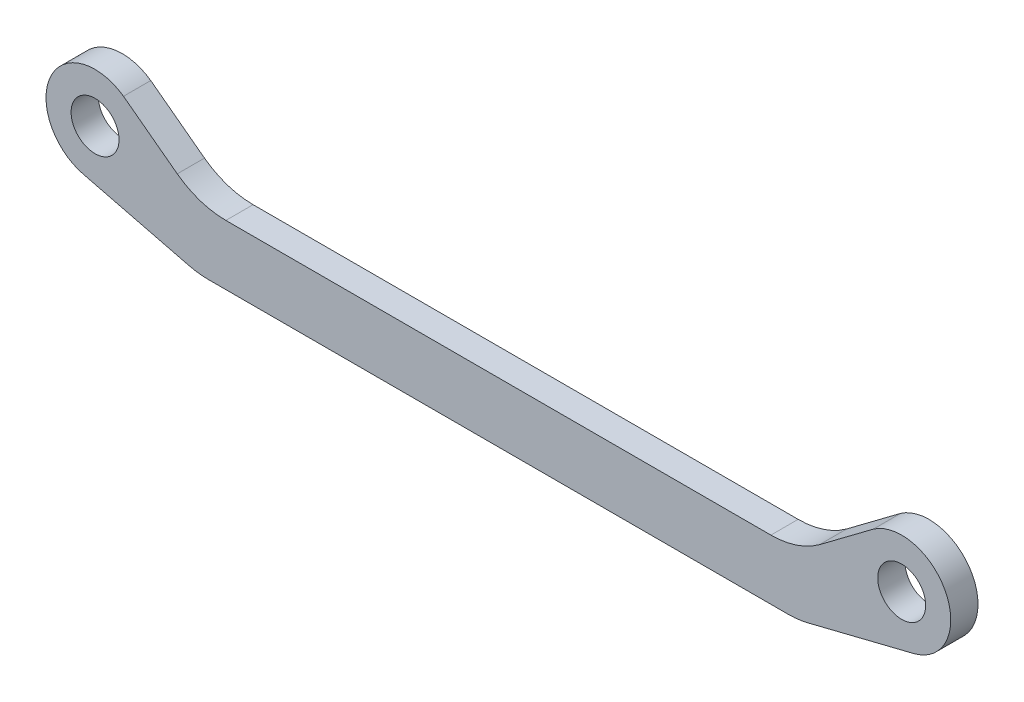
ISO-10303-21;
HEADER;
FILE_DESCRIPTION(('STEP AP214'),'2;1');
FILE_NAME('part.step','',(''),(''),'','','');
FILE_SCHEMA(('AUTOMOTIVE_DESIGN { 1 0 10303 214 1 1 1 1 }'));
ENDSEC;
DATA;
#1=APPLICATION_CONTEXT('core data for automotive mechanical design processes');
#2=APPLICATION_PROTOCOL_DEFINITION('international standard','automotive_design',2000,#1);
#3=PRODUCT_CONTEXT('',#1,'mechanical');
#4=PRODUCT('Part','Part','',(#3));
#5=PRODUCT_RELATED_PRODUCT_CATEGORY('part','',(#4));
#6=PRODUCT_DEFINITION_FORMATION('','',#4);
#7=PRODUCT_DEFINITION_CONTEXT('part definition',#1,'design');
#8=PRODUCT_DEFINITION('design','',#6,#7);
#9=PRODUCT_DEFINITION_SHAPE('','',#8);
#10=(LENGTH_UNIT() NAMED_UNIT(*) SI_UNIT(.MILLI.,.METRE.));
#11=(NAMED_UNIT(*) PLANE_ANGLE_UNIT() SI_UNIT($,.RADIAN.));
#12=(NAMED_UNIT(*) SI_UNIT($,.STERADIAN.) SOLID_ANGLE_UNIT());
#13=UNCERTAINTY_MEASURE_WITH_UNIT(LENGTH_MEASURE(1.E-05),#10,'distance_accuracy_value','');
#14=(GEOMETRIC_REPRESENTATION_CONTEXT(3) GLOBAL_UNCERTAINTY_ASSIGNED_CONTEXT((#13)) GLOBAL_UNIT_ASSIGNED_CONTEXT((#10,
#11,#12)) REPRESENTATION_CONTEXT('',''));
#15=CARTESIAN_POINT('',(0.,0.,0.));
#16=DIRECTION('',(0.,0.,1.));
#17=DIRECTION('',(1.,0.,0.));
#18=AXIS2_PLACEMENT_3D('',#15,#16,#17);
#19=CARTESIAN_POINT('',(-73.6141700346524,2.68327677533398,5.));
#20=DIRECTION('',(0.,0.,1.));
#21=DIRECTION('',(1.,0.,0.));
#22=AXIS2_PLACEMENT_3D('',#19,#20,#21);
#23=PLANE('',#22);
#24=CARTESIAN_POINT('',(-73.6141700346524,2.68327677533398,5.));
#25=DIRECTION('',(0.,0.,1.));
#26=DIRECTION('',(1.,0.,0.));
#27=AXIS2_PLACEMENT_3D('',#24,#25,#26);
#28=CIRCLE('',#27,4.40000000666373);
#29=CARTESIAN_POINT('',(-69.2141700279886,2.68327677533398,5.));
#30=VERTEX_POINT('',#29);
#31=EDGE_CURVE('E157',#30,#30,#28,.T.);
#32=ORIENTED_EDGE('',*,*,#31,.F.);
#33=EDGE_LOOP('',(#32));
#34=FACE_BOUND('',#33,.T.);
#35=CARTESIAN_POINT('',(-73.6141700346524,2.68327677533398,5.));
#36=DIRECTION('',(0.,0.,1.));
#37=DIRECTION('',(1.,0.,0.));
#38=AXIS2_PLACEMENT_3D('',#35,#36,#37);
#39=CIRCLE('',#38,9.);
#40=CARTESIAN_POINT('',(-68.395303593137,10.0156319948814,5.));
#41=VERTEX_POINT('',#40);
#42=CARTESIAN_POINT('',(-75.5919336060408,-6.09672614355442,5.));
#43=VERTEX_POINT('',#42);
#44=EDGE_CURVE('E176',#41,#43,#39,.T.);
#45=ORIENTED_EDGE('',*,*,#44,.T.);
#46=DIRECTION('',(0.970405668227117,-0.241480514892367,0.));
#47=VECTOR('',#46,1.);
#48=CARTESIAN_POINT('',(-75.5919336060408,-6.09672614355442,5.));
#49=LINE('',#48,#47);
#50=CARTESIAN_POINT('',(-56.3989244363623,-10.8728088565657,5.));
#51=VERTEX_POINT('',#50);
#52=EDGE_CURVE('E104',#43,#51,#49,.T.);
#53=ORIENTED_EDGE('',*,*,#52,.T.);
#54=CARTESIAN_POINT('',(-52.7767167129768,3.68327616684083,5.));
#55=DIRECTION('',(0.,0.,1.));
#56=DIRECTION('',(1.,0.,0.));
#57=AXIS2_PLACEMENT_3D('',#54,#55,#56);
#58=CIRCLE('',#57,14.9999999999997);
#59=CARTESIAN_POINT('',(-52.7767167129768,-11.3167238331587,5.));
#60=VERTEX_POINT('',#59);
#61=EDGE_CURVE('E203',#51,#60,#58,.T.);
#62=ORIENTED_EDGE('',*,*,#61,.T.);
#63=DIRECTION('',(1.,0.,0.));
#64=VECTOR('',#63,1.);
#65=CARTESIAN_POINT('',(-52.7767167129768,-11.3167238331587,5.));
#66=LINE('',#65,#64);
#67=CARTESIAN_POINT('',(53.5483758441745,-11.3167238331588,5.));
#68=VERTEX_POINT('',#67);
#69=EDGE_CURVE('E222',#60,#68,#66,.T.);
#70=ORIENTED_EDGE('',*,*,#69,.T.);
#71=CARTESIAN_POINT('',(53.5483758441745,3.68327616684128,5.));
#72=DIRECTION('',(0.,0.,1.));
#73=DIRECTION('',(1.,0.,0.));
#74=AXIS2_PLACEMENT_3D('',#71,#72,#73);
#75=CIRCLE('',#74,15.);
#76=CARTESIAN_POINT('',(57.1705835675583,-10.8728088565659,5.));
#77=VERTEX_POINT('',#76);
#78=EDGE_CURVE('E219',#68,#77,#75,.T.);
#79=ORIENTED_EDGE('',*,*,#78,.T.);
#80=DIRECTION('',(0.970405649115692,0.2414805916929,0.));
#81=VECTOR('',#80,1.);
#82=CARTESIAN_POINT('',(57.1705835675583,-10.8728088565659,5.));
#83=LINE('',#82,#81);
#84=CARTESIAN_POINT('',(76.3635862550964,-6.09672614355442,5.));
#85=VERTEX_POINT('',#84);
#86=EDGE_CURVE('E221',#77,#85,#83,.T.);
#87=ORIENTED_EDGE('',*,*,#86,.T.);
#88=CARTESIAN_POINT('',(74.3858291688885,2.68327823616854,5.));
#89=DIRECTION('',(0.,0.,1.));
#90=DIRECTION('',(1.,0.,0.));
#91=AXIS2_PLACEMENT_3D('',#88,#89,#90);
#92=CIRCLE('',#91,9.);
#93=CARTESIAN_POINT('',(69.1669606749438,10.0156319948814,5.));
#94=VERTEX_POINT('',#93);
#95=EDGE_CURVE('E224',#85,#94,#92,.T.);
#96=ORIENTED_EDGE('',*,*,#95,.T.);
#97=DIRECTION('',(-0.800152231556398,-0.599796970928761,0.));
#98=VECTOR('',#97,1.);
#99=CARTESIAN_POINT('',(69.1669606749438,10.0156319948814,5.));
#100=LINE('',#99,#98);
#101=CARTESIAN_POINT('',(59.3056303691909,2.62354357289025,5.));
#102=VERTEX_POINT('',#101);
#103=EDGE_CURVE('E230',#94,#102,#100,.T.);
#104=ORIENTED_EDGE('',*,*,#103,.T.);
#105=CARTESIAN_POINT('',(50.3858299247565,14.6832765728977,5.));
#106=DIRECTION('',(0.,0.,-1.));
#107=DIRECTION('',(1.,0.,0.));
#108=AXIS2_PLACEMENT_3D('',#105,#106,#107);
#109=CIRCLE('',#108,15.);
#110=CARTESIAN_POINT('',(50.3858299247565,-0.316723427102195,5.));
#111=VERTEX_POINT('',#110);
#112=EDGE_CURVE('E135',#102,#111,#109,.T.);
#113=ORIENTED_EDGE('',*,*,#112,.T.);
#114=DIRECTION('',(-1.,0.,0.));
#115=VECTOR('',#114,1.);
#116=CARTESIAN_POINT('',(50.3858299247565,-0.316723427102195,5.));
#117=LINE('',#116,#115);
#118=CARTESIAN_POINT('',(-49.614170039987,-0.316723427102324,5.));
#119=VERTEX_POINT('',#118);
#120=EDGE_CURVE('E129',#111,#119,#117,.T.);
#121=ORIENTED_EDGE('',*,*,#120,.T.);
#122=CARTESIAN_POINT('',(-49.614170039987,14.6832765728979,5.));
#123=DIRECTION('',(0.,0.,-1.));
#124=DIRECTION('',(1.,0.,0.));
#125=AXIS2_PLACEMENT_3D('',#122,#123,#124);
#126=CIRCLE('',#125,15.0000000000002);
#127=CARTESIAN_POINT('',(-58.5339704844212,2.62354357289016,5.));
#128=VERTEX_POINT('',#127);
#129=EDGE_CURVE('E133',#119,#128,#126,.T.);
#130=ORIENTED_EDGE('',*,*,#129,.T.);
#131=DIRECTION('',(-0.800152313377043,0.599796861776857,0.));
#132=VECTOR('',#131,1.);
#133=CARTESIAN_POINT('',(-58.5339704844212,2.62354357289016,5.));
#134=LINE('',#133,#132);
#135=EDGE_CURVE('E49',#128,#41,#134,.T.);
#136=ORIENTED_EDGE('',*,*,#135,.T.);
#137=EDGE_LOOP('',(#45,#53,#62,#70,#79,#87,#96,#104,#113,#121,#130,#136));
#138=FACE_BOUND('',#137,.T.);
#139=CARTESIAN_POINT('',(74.3858291688885,2.68327823616854,5.));
#140=DIRECTION('',(0.,0.,1.));
#141=DIRECTION('',(1.,0.,0.));
#142=AXIS2_PLACEMENT_3D('',#139,#140,#141);
#143=CIRCLE('',#142,4.4);
#144=CARTESIAN_POINT('',(78.7858291688885,2.68327823616854,5.));
#145=VERTEX_POINT('',#144);
#146=EDGE_CURVE('E272',#145,#145,#143,.T.);
#147=ORIENTED_EDGE('',*,*,#146,.F.);
#148=EDGE_LOOP('',(#147));
#149=FACE_BOUND('',#148,.T.);
#150=ADVANCED_FACE('F32',(#34,#138,#149),#23,.T.);
#151=CARTESIAN_POINT('',(-73.6141700346524,2.68327677533398,0.));
#152=DIRECTION('',(0.,0.,1.));
#153=DIRECTION('',(1.,0.,0.));
#154=AXIS2_PLACEMENT_3D('',#151,#152,#153);
#155=PLANE('',#154);
#156=CARTESIAN_POINT('',(-73.6141700346524,2.68327677533398,0.));
#157=DIRECTION('',(0.,0.,1.));
#158=DIRECTION('',(1.,0.,0.));
#159=AXIS2_PLACEMENT_3D('',#156,#157,#158);
#160=CIRCLE('',#159,9.);
#161=CARTESIAN_POINT('',(-68.395303593137,10.0156319948814,0.));
#162=VERTEX_POINT('',#161);
#163=CARTESIAN_POINT('',(-75.5919336060408,-6.09672614355442,0.));
#164=VERTEX_POINT('',#163);
#165=EDGE_CURVE('E153',#162,#164,#160,.T.);
#166=ORIENTED_EDGE('',*,*,#165,.F.);
#167=DIRECTION('',(-0.800152313377043,0.599796861776857,0.));
#168=VECTOR('',#167,1.);
#169=CARTESIAN_POINT('',(-58.5339704844212,2.62354357289016,0.));
#170=LINE('',#169,#168);
#171=CARTESIAN_POINT('',(-58.5339704844212,2.62354357289016,0.));
#172=VERTEX_POINT('',#171);
#173=EDGE_CURVE('E96',#172,#162,#170,.T.);
#174=ORIENTED_EDGE('',*,*,#173,.F.);
#175=CARTESIAN_POINT('',(-49.614170039987,14.6832765728979,0.));
#176=DIRECTION('',(0.,0.,-1.));
#177=DIRECTION('',(1.,0.,0.));
#178=AXIS2_PLACEMENT_3D('',#175,#176,#177);
#179=CIRCLE('',#178,15.0000000000002);
#180=CARTESIAN_POINT('',(-49.614170039987,-0.316723427102324,0.));
#181=VERTEX_POINT('',#180);
#182=EDGE_CURVE('E90',#181,#172,#179,.T.);
#183=ORIENTED_EDGE('',*,*,#182,.F.);
#184=DIRECTION('',(-1.,0.,0.));
#185=VECTOR('',#184,1.);
#186=CARTESIAN_POINT('',(50.3858299247565,-0.316723427102195,0.));
#187=LINE('',#186,#185);
#188=CARTESIAN_POINT('',(50.3858299247565,-0.316723427102195,0.));
#189=VERTEX_POINT('',#188);
#190=EDGE_CURVE('E143',#189,#181,#187,.T.);
#191=ORIENTED_EDGE('',*,*,#190,.F.);
#192=CARTESIAN_POINT('',(50.3858299247565,14.6832765728977,0.));
#193=DIRECTION('',(0.,0.,-1.));
#194=DIRECTION('',(1.,0.,0.));
#195=AXIS2_PLACEMENT_3D('',#192,#193,#194);
#196=CIRCLE('',#195,15.);
#197=CARTESIAN_POINT('',(59.3056303691909,2.62354357289025,0.));
#198=VERTEX_POINT('',#197);
#199=EDGE_CURVE('E171',#198,#189,#196,.T.);
#200=ORIENTED_EDGE('',*,*,#199,.F.);
#201=DIRECTION('',(-0.800152231556398,-0.599796970928761,0.));
#202=VECTOR('',#201,1.);
#203=CARTESIAN_POINT('',(69.1669606749438,10.0156319948814,0.));
#204=LINE('',#203,#202);
#205=CARTESIAN_POINT('',(69.1669606749438,10.0156319948814,0.));
#206=VERTEX_POINT('',#205);
#207=EDGE_CURVE('E169',#206,#198,#204,.T.);
#208=ORIENTED_EDGE('',*,*,#207,.F.);
#209=CARTESIAN_POINT('',(74.3858291688885,2.68327823616854,0.));
#210=DIRECTION('',(0.,0.,1.));
#211=DIRECTION('',(1.,0.,0.));
#212=AXIS2_PLACEMENT_3D('',#209,#210,#211);
#213=CIRCLE('',#212,9.);
#214=CARTESIAN_POINT('',(76.3635862550964,-6.09672614355442,0.));
#215=VERTEX_POINT('',#214);
#216=EDGE_CURVE('E167',#215,#206,#213,.T.);
#217=ORIENTED_EDGE('',*,*,#216,.F.);
#218=DIRECTION('',(0.970405649115692,0.2414805916929,0.));
#219=VECTOR('',#218,1.);
#220=CARTESIAN_POINT('',(57.1705835675583,-10.8728088565659,0.));
#221=LINE('',#220,#219);
#222=CARTESIAN_POINT('',(57.1705835675583,-10.8728088565659,0.));
#223=VERTEX_POINT('',#222);
#224=EDGE_CURVE('E165',#223,#215,#221,.T.);
#225=ORIENTED_EDGE('',*,*,#224,.F.);
#226=CARTESIAN_POINT('',(53.5483758441745,3.68327616684128,0.));
#227=DIRECTION('',(0.,0.,1.));
#228=DIRECTION('',(1.,0.,0.));
#229=AXIS2_PLACEMENT_3D('',#226,#227,#228);
#230=CIRCLE('',#229,15.);
#231=CARTESIAN_POINT('',(53.5483758441745,-11.3167238331588,0.));
#232=VERTEX_POINT('',#231);
#233=EDGE_CURVE('E163',#232,#223,#230,.T.);
#234=ORIENTED_EDGE('',*,*,#233,.F.);
#235=DIRECTION('',(1.,0.,0.));
#236=VECTOR('',#235,1.);
#237=CARTESIAN_POINT('',(-52.7767167129768,-11.3167238331587,0.));
#238=LINE('',#237,#236);
#239=CARTESIAN_POINT('',(-52.7767167129768,-11.3167238331587,0.));
#240=VERTEX_POINT('',#239);
#241=EDGE_CURVE('E161',#240,#232,#238,.T.);
#242=ORIENTED_EDGE('',*,*,#241,.F.);
#243=CARTESIAN_POINT('',(-52.7767167129768,3.68327616684083,0.));
#244=DIRECTION('',(0.,0.,1.));
#245=DIRECTION('',(1.,0.,0.));
#246=AXIS2_PLACEMENT_3D('',#243,#244,#245);
#247=CIRCLE('',#246,14.9999999999997);
#248=CARTESIAN_POINT('',(-56.3989244363623,-10.8728088565657,0.));
#249=VERTEX_POINT('',#248);
#250=EDGE_CURVE('E159',#249,#240,#247,.T.);
#251=ORIENTED_EDGE('',*,*,#250,.F.);
#252=DIRECTION('',(0.970405668227117,-0.241480514892367,0.));
#253=VECTOR('',#252,1.);
#254=CARTESIAN_POINT('',(-75.5919336060408,-6.09672614355442,0.));
#255=LINE('',#254,#253);
#256=EDGE_CURVE('E156',#164,#249,#255,.T.);
#257=ORIENTED_EDGE('',*,*,#256,.F.);
#258=EDGE_LOOP('',(#166,#174,#183,#191,#200,#208,#217,#225,#234,#242,#251,#257));
#259=FACE_BOUND('',#258,.T.);
#260=CARTESIAN_POINT('',(-73.6141700346524,2.68327677533398,0.));
#261=DIRECTION('',(0.,0.,1.));
#262=DIRECTION('',(1.,0.,0.));
#263=AXIS2_PLACEMENT_3D('',#260,#261,#262);
#264=CIRCLE('',#263,4.40000000666373);
#265=CARTESIAN_POINT('',(-69.2141700279886,2.68327677533398,0.));
#266=VERTEX_POINT('',#265);
#267=EDGE_CURVE('E278',#266,#266,#264,.T.);
#268=ORIENTED_EDGE('',*,*,#267,.T.);
#269=EDGE_LOOP('',(#268));
#270=FACE_BOUND('',#269,.T.);
#271=CARTESIAN_POINT('',(74.3858291688885,2.68327823616854,0.));
#272=DIRECTION('',(0.,0.,1.));
#273=DIRECTION('',(1.,0.,0.));
#274=AXIS2_PLACEMENT_3D('',#271,#272,#273);
#275=CIRCLE('',#274,4.4);
#276=CARTESIAN_POINT('',(78.7858291688885,2.68327823616854,0.));
#277=VERTEX_POINT('',#276);
#278=EDGE_CURVE('E275',#277,#277,#275,.T.);
#279=ORIENTED_EDGE('',*,*,#278,.T.);
#280=EDGE_LOOP('',(#279));
#281=FACE_BOUND('',#280,.T.);
#282=ADVANCED_FACE('F207',(#259,#270,#281),#155,.F.);
#283=CARTESIAN_POINT('',(-73.6141700346524,2.68327677533398,5.));
#284=DIRECTION('',(0.,0.,-1.));
#285=DIRECTION('',(-1.,0.,0.));
#286=AXIS2_PLACEMENT_3D('',#283,#284,#285);
#287=CYLINDRICAL_SURFACE('',#286,9.);
#288=ORIENTED_EDGE('',*,*,#165,.T.);
#289=DIRECTION('',(0.,0.,-1.));
#290=VECTOR('',#289,1.);
#291=CARTESIAN_POINT('',(-75.5919336060408,-6.09672614355442,5.));
#292=LINE('',#291,#290);
#293=EDGE_CURVE('E11',#43,#164,#292,.T.);
#294=ORIENTED_EDGE('',*,*,#293,.F.);
#295=ORIENTED_EDGE('',*,*,#44,.F.);
#296=DIRECTION('',(0.,0.,-1.));
#297=VECTOR('',#296,1.);
#298=CARTESIAN_POINT('',(-68.395303593137,10.0156319948814,5.));
#299=LINE('',#298,#297);
#300=EDGE_CURVE('E149',#41,#162,#299,.T.);
#301=ORIENTED_EDGE('',*,*,#300,.T.);
#302=EDGE_LOOP('',(#288,#294,#295,#301));
#303=FACE_BOUND('',#302,.T.);
#304=ADVANCED_FACE('F34',(#303),#287,.T.);
#305=CARTESIAN_POINT('',(-75.5919336060408,-6.09672614355442,5.));
#306=DIRECTION('',(0.241480514892367,0.970405668227117,0.));
#307=DIRECTION('',(-0.970405668227117,0.241480514892367,0.));
#308=AXIS2_PLACEMENT_3D('',#305,#306,#307);
#309=PLANE('',#308);
#310=ORIENTED_EDGE('',*,*,#256,.T.);
#311=DIRECTION('',(0.,0.,-1.));
#312=VECTOR('',#311,1.);
#313=CARTESIAN_POINT('',(-56.3989244363623,-10.8728088565657,5.));
#314=LINE('',#313,#312);
#315=EDGE_CURVE('E41',#51,#249,#314,.T.);
#316=ORIENTED_EDGE('',*,*,#315,.F.);
#317=ORIENTED_EDGE('',*,*,#52,.F.);
#318=ORIENTED_EDGE('',*,*,#293,.T.);
#319=EDGE_LOOP('',(#310,#316,#317,#318));
#320=FACE_BOUND('',#319,.T.);
#321=ADVANCED_FACE('F371',(#320),#309,.F.);
#322=CARTESIAN_POINT('',(-52.7767167129768,3.68327616684083,5.));
#323=DIRECTION('',(0.,0.,-1.));
#324=DIRECTION('',(-1.,0.,0.));
#325=AXIS2_PLACEMENT_3D('',#322,#323,#324);
#326=CYLINDRICAL_SURFACE('',#325,14.9999999999997);
#327=ORIENTED_EDGE('',*,*,#250,.T.);
#328=DIRECTION('',(0.,0.,-1.));
#329=VECTOR('',#328,1.);
#330=CARTESIAN_POINT('',(-52.7767167129768,-11.3167238331587,5.));
#331=LINE('',#330,#329);
#332=EDGE_CURVE('E195',#60,#240,#331,.T.);
#333=ORIENTED_EDGE('',*,*,#332,.F.);
#334=ORIENTED_EDGE('',*,*,#61,.F.);
#335=ORIENTED_EDGE('',*,*,#315,.T.);
#336=EDGE_LOOP('',(#327,#333,#334,#335));
#337=FACE_BOUND('',#336,.T.);
#338=ADVANCED_FACE('F201',(#337),#326,.T.);
#339=CARTESIAN_POINT('',(-52.7767167129768,-11.3167238331587,5.));
#340=DIRECTION('',(0.,1.,0.));
#341=DIRECTION('',(-1.,0.,0.));
#342=AXIS2_PLACEMENT_3D('',#339,#340,#341);
#343=PLANE('',#342);
#344=ORIENTED_EDGE('',*,*,#241,.T.);
#345=DIRECTION('',(0.,0.,-1.));
#346=VECTOR('',#345,1.);
#347=CARTESIAN_POINT('',(53.5483758441745,-11.3167238331588,5.));
#348=LINE('',#347,#346);
#349=EDGE_CURVE('E192',#68,#232,#348,.T.);
#350=ORIENTED_EDGE('',*,*,#349,.F.);
#351=ORIENTED_EDGE('',*,*,#69,.F.);
#352=ORIENTED_EDGE('',*,*,#332,.T.);
#353=EDGE_LOOP('',(#344,#350,#351,#352));
#354=FACE_BOUND('',#353,.T.);
#355=ADVANCED_FACE('F213',(#354),#343,.F.);
#356=CARTESIAN_POINT('',(53.5483758441745,3.68327616684128,5.));
#357=DIRECTION('',(0.,0.,-1.));
#358=DIRECTION('',(-1.,0.,0.));
#359=AXIS2_PLACEMENT_3D('',#356,#357,#358);
#360=CYLINDRICAL_SURFACE('',#359,15.);
#361=ORIENTED_EDGE('',*,*,#233,.T.);
#362=DIRECTION('',(0.,0.,-1.));
#363=VECTOR('',#362,1.);
#364=CARTESIAN_POINT('',(57.1705835675583,-10.8728088565659,5.));
#365=LINE('',#364,#363);
#366=EDGE_CURVE('E189',#77,#223,#365,.T.);
#367=ORIENTED_EDGE('',*,*,#366,.F.);
#368=ORIENTED_EDGE('',*,*,#78,.F.);
#369=ORIENTED_EDGE('',*,*,#349,.T.);
#370=EDGE_LOOP('',(#361,#367,#368,#369));
#371=FACE_BOUND('',#370,.T.);
#372=ADVANCED_FACE('F217',(#371),#360,.T.);
#373=CARTESIAN_POINT('',(57.1705835675583,-10.8728088565659,5.));
#374=DIRECTION('',(-0.2414805916929,0.970405649115692,0.));
#375=DIRECTION('',(-0.970405649115692,-0.2414805916929,0.));
#376=AXIS2_PLACEMENT_3D('',#373,#374,#375);
#377=PLANE('',#376);
#378=ORIENTED_EDGE('',*,*,#224,.T.);
#379=DIRECTION('',(0.,0.,-1.));
#380=VECTOR('',#379,1.);
#381=CARTESIAN_POINT('',(76.3635862550964,-6.09672614355442,5.));
#382=LINE('',#381,#380);
#383=EDGE_CURVE('E186',#85,#215,#382,.T.);
#384=ORIENTED_EDGE('',*,*,#383,.F.);
#385=ORIENTED_EDGE('',*,*,#86,.F.);
#386=ORIENTED_EDGE('',*,*,#366,.T.);
#387=EDGE_LOOP('',(#378,#384,#385,#386));
#388=FACE_BOUND('',#387,.T.);
#389=ADVANCED_FACE('F336',(#388),#377,.F.);
#390=CARTESIAN_POINT('',(74.3858291688885,2.68327823616854,5.));
#391=DIRECTION('',(0.,0.,-1.));
#392=DIRECTION('',(-1.,0.,0.));
#393=AXIS2_PLACEMENT_3D('',#390,#391,#392);
#394=CYLINDRICAL_SURFACE('',#393,9.);
#395=ORIENTED_EDGE('',*,*,#216,.T.);
#396=DIRECTION('',(0.,0.,-1.));
#397=VECTOR('',#396,1.);
#398=CARTESIAN_POINT('',(69.1669606749438,10.0156319948814,5.));
#399=LINE('',#398,#397);
#400=EDGE_CURVE('E183',#94,#206,#399,.T.);
#401=ORIENTED_EDGE('',*,*,#400,.F.);
#402=ORIENTED_EDGE('',*,*,#95,.F.);
#403=ORIENTED_EDGE('',*,*,#383,.T.);
#404=EDGE_LOOP('',(#395,#401,#402,#403));
#405=FACE_BOUND('',#404,.T.);
#406=ADVANCED_FACE('F327',(#405),#394,.T.);
#407=CARTESIAN_POINT('',(69.1669606749438,10.0156319948814,5.));
#408=DIRECTION('',(0.599796970928761,-0.800152231556398,0.));
#409=DIRECTION('',(0.800152231556398,0.599796970928761,0.));
#410=AXIS2_PLACEMENT_3D('',#407,#408,#409);
#411=PLANE('',#410);
#412=ORIENTED_EDGE('',*,*,#207,.T.);
#413=DIRECTION('',(0.,0.,-1.));
#414=VECTOR('',#413,1.);
#415=CARTESIAN_POINT('',(59.3056303691909,2.62354357289025,5.));
#416=LINE('',#415,#414);
#417=EDGE_CURVE('E180',#102,#198,#416,.T.);
#418=ORIENTED_EDGE('',*,*,#417,.F.);
#419=ORIENTED_EDGE('',*,*,#103,.F.);
#420=ORIENTED_EDGE('',*,*,#400,.T.);
#421=EDGE_LOOP('',(#412,#418,#419,#420));
#422=FACE_BOUND('',#421,.T.);
#423=ADVANCED_FACE('F236',(#422),#411,.F.);
#424=CARTESIAN_POINT('',(50.3858299247565,14.6832765728977,5.));
#425=DIRECTION('',(0.,0.,-1.));
#426=DIRECTION('',(-1.,0.,0.));
#427=AXIS2_PLACEMENT_3D('',#424,#425,#426);
#428=CYLINDRICAL_SURFACE('',#427,15.);
#429=ORIENTED_EDGE('',*,*,#199,.T.);
#430=DIRECTION('',(0.,0.,-1.));
#431=VECTOR('',#430,1.);
#432=CARTESIAN_POINT('',(50.3858299247565,-0.316723427102195,5.));
#433=LINE('',#432,#431);
#434=EDGE_CURVE('E144',#111,#189,#433,.T.);
#435=ORIENTED_EDGE('',*,*,#434,.F.);
#436=ORIENTED_EDGE('',*,*,#112,.F.);
#437=ORIENTED_EDGE('',*,*,#417,.T.);
#438=EDGE_LOOP('',(#429,#435,#436,#437));
#439=FACE_BOUND('',#438,.T.);
#440=ADVANCED_FACE('F240',(#439),#428,.F.);
#441=CARTESIAN_POINT('',(50.3858299247565,-0.316723427102195,5.));
#442=DIRECTION('',(0.,-1.,0.));
#443=DIRECTION('',(1.,0.,0.));
#444=AXIS2_PLACEMENT_3D('',#441,#442,#443);
#445=PLANE('',#444);
#446=ORIENTED_EDGE('',*,*,#190,.T.);
#447=DIRECTION('',(0.,0.,-1.));
#448=VECTOR('',#447,1.);
#449=CARTESIAN_POINT('',(-49.614170039987,-0.316723427102324,5.));
#450=LINE('',#449,#448);
#451=EDGE_CURVE('E140',#119,#181,#450,.T.);
#452=ORIENTED_EDGE('',*,*,#451,.F.);
#453=ORIENTED_EDGE('',*,*,#120,.F.);
#454=ORIENTED_EDGE('',*,*,#434,.T.);
#455=EDGE_LOOP('',(#446,#452,#453,#454));
#456=FACE_BOUND('',#455,.T.);
#457=ADVANCED_FACE('F141',(#456),#445,.F.);
#458=CARTESIAN_POINT('',(-49.614170039987,14.6832765728979,5.));
#459=DIRECTION('',(0.,0.,-1.));
#460=DIRECTION('',(-1.,0.,0.));
#461=AXIS2_PLACEMENT_3D('',#458,#459,#460);
#462=CYLINDRICAL_SURFACE('',#461,15.0000000000002);
#463=ORIENTED_EDGE('',*,*,#182,.T.);
#464=DIRECTION('',(0.,0.,-1.));
#465=VECTOR('',#464,1.);
#466=CARTESIAN_POINT('',(-58.5339704844212,2.62354357289016,5.));
#467=LINE('',#466,#465);
#468=EDGE_CURVE('E145',#128,#172,#467,.T.);
#469=ORIENTED_EDGE('',*,*,#468,.F.);
#470=ORIENTED_EDGE('',*,*,#129,.F.);
#471=ORIENTED_EDGE('',*,*,#451,.T.);
#472=EDGE_LOOP('',(#463,#469,#470,#471));
#473=FACE_BOUND('',#472,.T.);
#474=ADVANCED_FACE('F147',(#473),#462,.F.);
#475=CARTESIAN_POINT('',(-58.5339704844212,2.62354357289016,5.));
#476=DIRECTION('',(-0.599796861776857,-0.800152313377043,0.));
#477=DIRECTION('',(0.800152313377043,-0.599796861776857,0.));
#478=AXIS2_PLACEMENT_3D('',#475,#476,#477);
#479=PLANE('',#478);
#480=ORIENTED_EDGE('',*,*,#173,.T.);
#481=ORIENTED_EDGE('',*,*,#300,.F.);
#482=ORIENTED_EDGE('',*,*,#135,.F.);
#483=ORIENTED_EDGE('',*,*,#468,.T.);
#484=EDGE_LOOP('',(#480,#481,#482,#483));
#485=FACE_BOUND('',#484,.T.);
#486=ADVANCED_FACE('F244',(#485),#479,.F.);
#487=CARTESIAN_POINT('',(-73.6141700346524,2.68327677533398,5.));
#488=DIRECTION('',(0.,0.,-1.));
#489=DIRECTION('',(-1.,0.,0.));
#490=AXIS2_PLACEMENT_3D('',#487,#488,#489);
#491=CYLINDRICAL_SURFACE('',#490,4.40000000666373);
#492=ORIENTED_EDGE('',*,*,#31,.T.);
#493=EDGE_LOOP('',(#492));
#494=FACE_BOUND('',#493,.T.);
#495=ORIENTED_EDGE('',*,*,#267,.F.);
#496=EDGE_LOOP('',(#495));
#497=FACE_BOUND('',#496,.T.);
#498=ADVANCED_FACE('F246',(#494,#497),#491,.F.);
#499=CARTESIAN_POINT('',(74.3858291688885,2.68327823616854,5.));
#500=DIRECTION('',(0.,0.,-1.));
#501=DIRECTION('',(-1.,0.,0.));
#502=AXIS2_PLACEMENT_3D('',#499,#500,#501);
#503=CYLINDRICAL_SURFACE('',#502,4.4);
#504=ORIENTED_EDGE('',*,*,#146,.T.);
#505=EDGE_LOOP('',(#504));
#506=FACE_BOUND('',#505,.T.);
#507=ORIENTED_EDGE('',*,*,#278,.F.);
#508=EDGE_LOOP('',(#507));
#509=FACE_BOUND('',#508,.T.);
#510=ADVANCED_FACE('F252',(#506,#509),#503,.F.);
#511=CLOSED_SHELL('',(#150,#282,#304,#321,#338,#355,#372,#389,#406,#423,#440,#457,#474,#486,
#498,#510));
#512=MANIFOLD_SOLID_BREP('B2',#511);
#513=ADVANCED_BREP_SHAPE_REPRESENTATION('',(#18,#512),#14);
#514=SHAPE_DEFINITION_REPRESENTATION(#9,#513);
ENDSEC;
END-ISO-10303-21;
